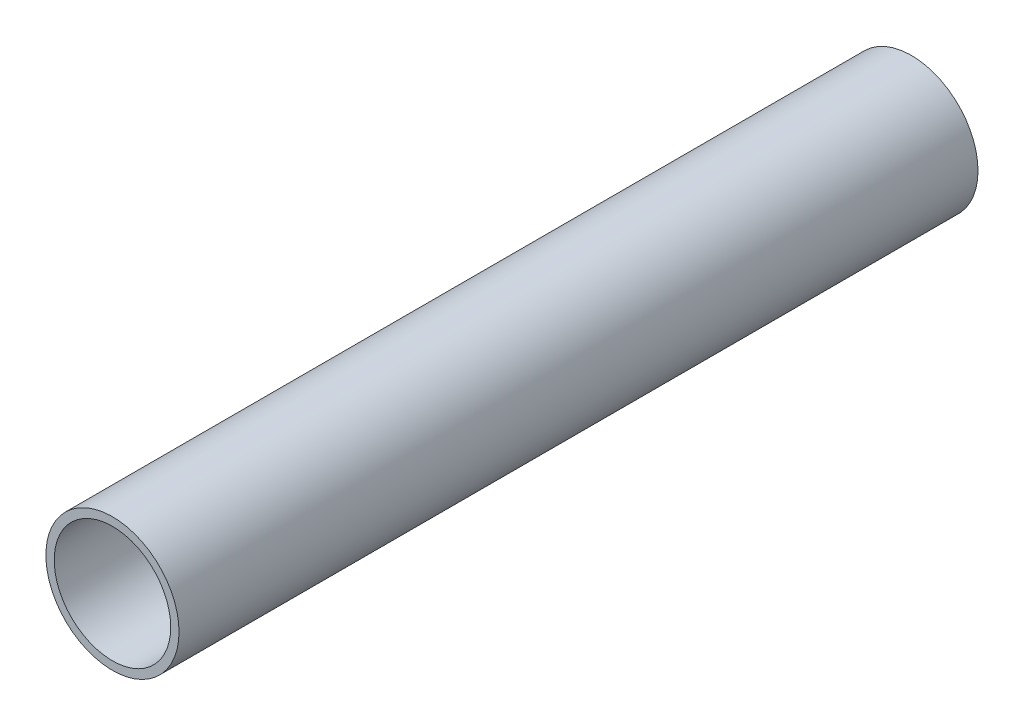
ISO-10303-21;
HEADER;
FILE_DESCRIPTION(('STEP AP214'),'2;1');
FILE_NAME('part.step','',(''),(''),'','','');
FILE_SCHEMA(('AUTOMOTIVE_DESIGN { 1 0 10303 214 1 1 1 1 }'));
ENDSEC;
DATA;
#1=APPLICATION_CONTEXT('core data for automotive mechanical design processes');
#2=APPLICATION_PROTOCOL_DEFINITION('international standard','automotive_design',2000,#1);
#3=PRODUCT_CONTEXT('',#1,'mechanical');
#4=PRODUCT('Part','Part','',(#3));
#5=PRODUCT_RELATED_PRODUCT_CATEGORY('part','',(#4));
#6=PRODUCT_DEFINITION_FORMATION('','',#4);
#7=PRODUCT_DEFINITION_CONTEXT('part definition',#1,'design');
#8=PRODUCT_DEFINITION('design','',#6,#7);
#9=PRODUCT_DEFINITION_SHAPE('','',#8);
#10=(LENGTH_UNIT() NAMED_UNIT(*) SI_UNIT(.MILLI.,.METRE.));
#11=(NAMED_UNIT(*) PLANE_ANGLE_UNIT() SI_UNIT($,.RADIAN.));
#12=(NAMED_UNIT(*) SI_UNIT($,.STERADIAN.) SOLID_ANGLE_UNIT());
#13=UNCERTAINTY_MEASURE_WITH_UNIT(LENGTH_MEASURE(1.E-05),#10,'distance_accuracy_value','');
#14=(GEOMETRIC_REPRESENTATION_CONTEXT(3) GLOBAL_UNCERTAINTY_ASSIGNED_CONTEXT((#13)) GLOBAL_UNIT_ASSIGNED_CONTEXT((#10,
#11,#12)) REPRESENTATION_CONTEXT('',''));
#15=CARTESIAN_POINT('',(0.,0.,0.));
#16=DIRECTION('',(0.,0.,1.));
#17=DIRECTION('',(1.,0.,0.));
#18=AXIS2_PLACEMENT_3D('',#15,#16,#17);
#19=CARTESIAN_POINT('',(0.,0.,152.4));
#20=DIRECTION('',(0.,0.,1.));
#21=DIRECTION('',(1.,0.,0.));
#22=AXIS2_PLACEMENT_3D('',#19,#20,#21);
#23=PLANE('',#22);
#24=CARTESIAN_POINT('',(0.,0.,152.4));
#25=DIRECTION('',(0.,0.,1.));
#26=DIRECTION('',(1.,0.,0.));
#27=AXIS2_PLACEMENT_3D('',#24,#25,#26);
#28=CIRCLE('',#27,25.4);
#29=CARTESIAN_POINT('',(25.4,0.,152.4));
#30=VERTEX_POINT('',#29);
#31=EDGE_CURVE('E10',#30,#30,#28,.T.);
#32=ORIENTED_EDGE('',*,*,#31,.T.);
#33=EDGE_LOOP('',(#32));
#34=FACE_BOUND('',#33,.T.);
#35=CARTESIAN_POINT('',(0.,0.,152.4));
#36=DIRECTION('',(0.,0.,1.));
#37=DIRECTION('',(1.,0.,0.));
#38=AXIS2_PLACEMENT_3D('',#35,#36,#37);
#39=CIRCLE('',#38,22.225);
#40=CARTESIAN_POINT('',(22.225,0.,152.4));
#41=VERTEX_POINT('',#40);
#42=EDGE_CURVE('E44',#41,#41,#39,.T.);
#43=ORIENTED_EDGE('',*,*,#42,.F.);
#44=EDGE_LOOP('',(#43));
#45=FACE_BOUND('',#44,.T.);
#46=ADVANCED_FACE('F37',(#34,#45),#23,.T.);
#47=CARTESIAN_POINT('',(0.,0.,152.4));
#48=DIRECTION('',(0.,0.,-1.));
#49=DIRECTION('',(-1.,0.,0.));
#50=AXIS2_PLACEMENT_3D('',#47,#48,#49);
#51=CYLINDRICAL_SURFACE('',#50,25.4);
#52=ORIENTED_EDGE('',*,*,#31,.F.);
#53=EDGE_LOOP('',(#52));
#54=FACE_BOUND('',#53,.T.);
#55=CARTESIAN_POINT('',(0.,0.,-152.4));
#56=DIRECTION('',(0.,0.,1.));
#57=DIRECTION('',(1.,0.,0.));
#58=AXIS2_PLACEMENT_3D('',#55,#56,#57);
#59=CIRCLE('',#58,25.4);
#60=CARTESIAN_POINT('',(25.4,0.,-152.4));
#61=VERTEX_POINT('',#60);
#62=EDGE_CURVE('E48',#61,#61,#59,.T.);
#63=ORIENTED_EDGE('',*,*,#62,.T.);
#64=EDGE_LOOP('',(#63));
#65=FACE_BOUND('',#64,.T.);
#66=ADVANCED_FACE('F39',(#54,#65),#51,.T.);
#67=CARTESIAN_POINT('',(0.,0.,152.4));
#68=DIRECTION('',(0.,0.,-1.));
#69=DIRECTION('',(-1.,0.,0.));
#70=AXIS2_PLACEMENT_3D('',#67,#68,#69);
#71=CYLINDRICAL_SURFACE('',#70,22.225);
#72=ORIENTED_EDGE('',*,*,#42,.T.);
#73=EDGE_LOOP('',(#72));
#74=FACE_BOUND('',#73,.T.);
#75=CARTESIAN_POINT('',(0.,0.,-152.4));
#76=DIRECTION('',(0.,0.,1.));
#77=DIRECTION('',(1.,0.,0.));
#78=AXIS2_PLACEMENT_3D('',#75,#76,#77);
#79=CIRCLE('',#78,22.225);
#80=CARTESIAN_POINT('',(22.225,0.,-152.4));
#81=VERTEX_POINT('',#80);
#82=EDGE_CURVE('E52',#81,#81,#79,.T.);
#83=ORIENTED_EDGE('',*,*,#82,.F.);
#84=EDGE_LOOP('',(#83));
#85=FACE_BOUND('',#84,.T.);
#86=ADVANCED_FACE('F61',(#74,#85),#71,.F.);
#87=CARTESIAN_POINT('',(0.,0.,-152.4));
#88=DIRECTION('',(0.,0.,1.));
#89=DIRECTION('',(1.,0.,0.));
#90=AXIS2_PLACEMENT_3D('',#87,#88,#89);
#91=PLANE('',#90);
#92=ORIENTED_EDGE('',*,*,#82,.T.);
#93=EDGE_LOOP('',(#92));
#94=FACE_BOUND('',#93,.T.);
#95=ORIENTED_EDGE('',*,*,#62,.F.);
#96=EDGE_LOOP('',(#95));
#97=FACE_BOUND('',#96,.T.);
#98=ADVANCED_FACE('F58',(#94,#97),#91,.F.);
#99=CLOSED_SHELL('',(#46,#66,#86,#98));
#100=MANIFOLD_SOLID_BREP('B2',#99);
#101=ADVANCED_BREP_SHAPE_REPRESENTATION('',(#18,#100),#14);
#102=SHAPE_DEFINITION_REPRESENTATION(#9,#101);
ENDSEC;
END-ISO-10303-21;
